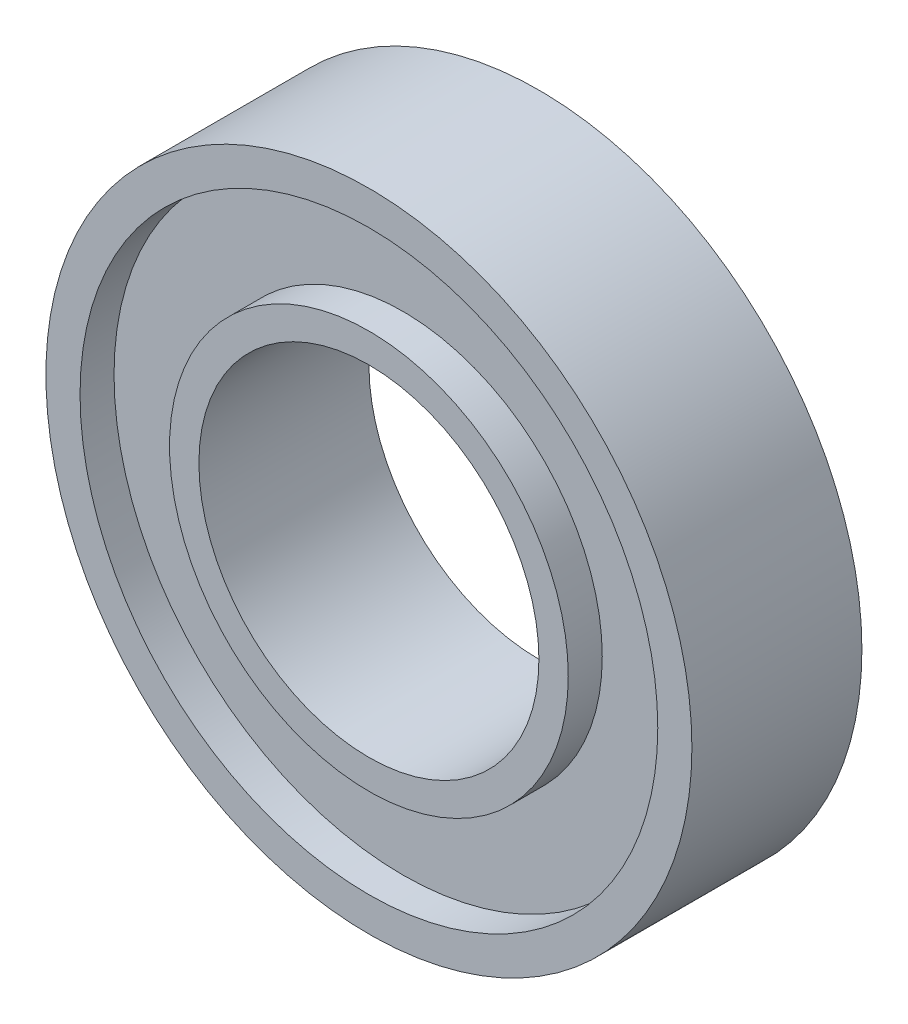
ISO-10303-21;
HEADER;
FILE_DESCRIPTION(('STEP AP214'),'2;1');
FILE_NAME('part.step','',(''),(''),'','','');
FILE_SCHEMA(('AUTOMOTIVE_DESIGN { 1 0 10303 214 1 1 1 1 }'));
ENDSEC;
DATA;
#1=APPLICATION_CONTEXT('core data for automotive mechanical design processes');
#2=APPLICATION_PROTOCOL_DEFINITION('international standard','automotive_design',2000,#1);
#3=PRODUCT_CONTEXT('',#1,'mechanical');
#4=PRODUCT('Part','Part','',(#3));
#5=PRODUCT_RELATED_PRODUCT_CATEGORY('part','',(#4));
#6=PRODUCT_DEFINITION_FORMATION('','',#4);
#7=PRODUCT_DEFINITION_CONTEXT('part definition',#1,'design');
#8=PRODUCT_DEFINITION('design','',#6,#7);
#9=PRODUCT_DEFINITION_SHAPE('','',#8);
#10=(LENGTH_UNIT() NAMED_UNIT(*) SI_UNIT(.MILLI.,.METRE.));
#11=(NAMED_UNIT(*) PLANE_ANGLE_UNIT() SI_UNIT($,.RADIAN.));
#12=(NAMED_UNIT(*) SI_UNIT($,.STERADIAN.) SOLID_ANGLE_UNIT());
#13=UNCERTAINTY_MEASURE_WITH_UNIT(LENGTH_MEASURE(1.E-05),#10,'distance_accuracy_value','');
#14=(GEOMETRIC_REPRESENTATION_CONTEXT(3) GLOBAL_UNCERTAINTY_ASSIGNED_CONTEXT((#13)) GLOBAL_UNIT_ASSIGNED_CONTEXT((#10,
#11,#12)) REPRESENTATION_CONTEXT('',''));
#15=CARTESIAN_POINT('',(0.,0.,0.));
#16=DIRECTION('',(0.,0.,1.));
#17=DIRECTION('',(1.,0.,0.));
#18=AXIS2_PLACEMENT_3D('',#15,#16,#17);
#19=CARTESIAN_POINT('',(0.,0.,0.));
#20=DIRECTION('',(0.,0.,1.));
#21=DIRECTION('',(1.,0.,0.));
#22=AXIS2_PLACEMENT_3D('',#19,#20,#21);
#23=PLANE('',#22);
#24=CARTESIAN_POINT('',(0.,0.,0.));
#25=DIRECTION('',(0.,0.,1.));
#26=DIRECTION('',(1.,0.,0.));
#27=AXIS2_PLACEMENT_3D('',#24,#25,#26);
#28=CIRCLE('',#27,5.);
#29=CARTESIAN_POINT('',(5.,0.,0.));
#30=VERTEX_POINT('',#29);
#31=EDGE_CURVE('E52',#30,#30,#28,.T.);
#32=ORIENTED_EDGE('',*,*,#31,.T.);
#33=EDGE_LOOP('',(#32));
#34=FACE_BOUND('',#33,.T.);
#35=CARTESIAN_POINT('',(0.,0.,0.));
#36=DIRECTION('',(0.,0.,1.));
#37=DIRECTION('',(1.,0.,0.));
#38=AXIS2_PLACEMENT_3D('',#35,#36,#37);
#39=CIRCLE('',#38,5.86336398365433);
#40=CARTESIAN_POINT('',(5.86336398365433,0.,0.));
#41=VERTEX_POINT('',#40);
#42=EDGE_CURVE('E84',#41,#41,#39,.T.);
#43=ORIENTED_EDGE('',*,*,#42,.F.);
#44=EDGE_LOOP('',(#43));
#45=FACE_BOUND('',#44,.T.);
#46=ADVANCED_FACE('F36',(#34,#45),#23,.F.);
#47=CARTESIAN_POINT('',(0.,0.,5.));
#48=DIRECTION('',(0.,0.,1.));
#49=DIRECTION('',(1.,0.,0.));
#50=AXIS2_PLACEMENT_3D('',#47,#48,#49);
#51=PLANE('',#50);
#52=CARTESIAN_POINT('',(0.,0.,5.));
#53=DIRECTION('',(0.,0.,1.));
#54=DIRECTION('',(1.,0.,0.));
#55=AXIS2_PLACEMENT_3D('',#52,#53,#54);
#56=CIRCLE('',#55,5.);
#57=CARTESIAN_POINT('',(5.,0.,5.));
#58=VERTEX_POINT('',#57);
#59=EDGE_CURVE('E50',#58,#58,#56,.T.);
#60=ORIENTED_EDGE('',*,*,#59,.F.);
#61=EDGE_LOOP('',(#60));
#62=FACE_BOUND('',#61,.T.);
#63=CARTESIAN_POINT('',(0.,0.,5.));
#64=DIRECTION('',(0.,0.,1.));
#65=DIRECTION('',(1.,0.,0.));
#66=AXIS2_PLACEMENT_3D('',#63,#64,#65);
#67=CIRCLE('',#66,5.86336398365433);
#68=CARTESIAN_POINT('',(5.86336398365433,0.,5.));
#69=VERTEX_POINT('',#68);
#70=EDGE_CURVE('E68',#69,#69,#67,.T.);
#71=ORIENTED_EDGE('',*,*,#70,.T.);
#72=EDGE_LOOP('',(#71));
#73=FACE_BOUND('',#72,.T.);
#74=ADVANCED_FACE('F101',(#62,#73),#51,.T.);
#75=CARTESIAN_POINT('',(0.,0.,5.));
#76=DIRECTION('',(0.,0.,1.));
#77=DIRECTION('',(1.,0.,0.));
#78=AXIS2_PLACEMENT_3D('',#75,#76,#77);
#79=CIRCLE('',#78,8.49623079290132);
#80=CARTESIAN_POINT('',(8.49623079290132,0.,5.));
#81=VERTEX_POINT('',#80);
#82=EDGE_CURVE('E60',#81,#81,#79,.T.);
#83=ORIENTED_EDGE('',*,*,#82,.F.);
#84=EDGE_LOOP('',(#83));
#85=FACE_BOUND('',#84,.T.);
#86=CARTESIAN_POINT('',(0.,0.,5.));
#87=DIRECTION('',(0.,0.,1.));
#88=DIRECTION('',(1.,0.,0.));
#89=AXIS2_PLACEMENT_3D('',#86,#87,#88);
#90=CIRCLE('',#89,9.5);
#91=CARTESIAN_POINT('',(9.5,0.,5.));
#92=VERTEX_POINT('',#91);
#93=EDGE_CURVE('E10',#92,#92,#90,.T.);
#94=ORIENTED_EDGE('',*,*,#93,.T.);
#95=EDGE_LOOP('',(#94));
#96=FACE_BOUND('',#95,.T.);
#97=ADVANCED_FACE('F107',(#85,#96),#51,.T.);
#98=CARTESIAN_POINT('',(0.,0.,0.));
#99=DIRECTION('',(0.,0.,1.));
#100=DIRECTION('',(1.,0.,0.));
#101=AXIS2_PLACEMENT_3D('',#98,#99,#100);
#102=CIRCLE('',#101,8.49623079290132);
#103=CARTESIAN_POINT('',(8.49623079290132,0.,0.));
#104=VERTEX_POINT('',#103);
#105=EDGE_CURVE('E76',#104,#104,#102,.T.);
#106=ORIENTED_EDGE('',*,*,#105,.T.);
#107=EDGE_LOOP('',(#106));
#108=FACE_BOUND('',#107,.T.);
#109=CARTESIAN_POINT('',(0.,0.,0.));
#110=DIRECTION('',(0.,0.,1.));
#111=DIRECTION('',(1.,0.,0.));
#112=AXIS2_PLACEMENT_3D('',#109,#110,#111);
#113=CIRCLE('',#112,9.5);
#114=CARTESIAN_POINT('',(9.5,0.,0.));
#115=VERTEX_POINT('',#114);
#116=EDGE_CURVE('E40',#115,#115,#113,.T.);
#117=ORIENTED_EDGE('',*,*,#116,.F.);
#118=EDGE_LOOP('',(#117));
#119=FACE_BOUND('',#118,.T.);
#120=ADVANCED_FACE('F103',(#108,#119),#23,.F.);
#121=CARTESIAN_POINT('',(0.,0.,5.));
#122=DIRECTION('',(0.,0.,-1.));
#123=DIRECTION('',(-1.,0.,0.));
#124=AXIS2_PLACEMENT_3D('',#121,#122,#123);
#125=CYLINDRICAL_SURFACE('',#124,9.5);
#126=ORIENTED_EDGE('',*,*,#93,.F.);
#127=EDGE_LOOP('',(#126));
#128=FACE_BOUND('',#127,.T.);
#129=ORIENTED_EDGE('',*,*,#116,.T.);
#130=EDGE_LOOP('',(#129));
#131=FACE_BOUND('',#130,.T.);
#132=ADVANCED_FACE('F38',(#128,#131),#125,.T.);
#133=CARTESIAN_POINT('',(0.,0.,5.));
#134=DIRECTION('',(0.,0.,-1.));
#135=DIRECTION('',(-1.,0.,0.));
#136=AXIS2_PLACEMENT_3D('',#133,#134,#135);
#137=CYLINDRICAL_SURFACE('',#136,5.);
#138=ORIENTED_EDGE('',*,*,#59,.T.);
#139=EDGE_LOOP('',(#138));
#140=FACE_BOUND('',#139,.T.);
#141=ORIENTED_EDGE('',*,*,#31,.F.);
#142=EDGE_LOOP('',(#141));
#143=FACE_BOUND('',#142,.T.);
#144=ADVANCED_FACE('F116',(#140,#143),#137,.F.);
#145=CARTESIAN_POINT('',(0.,0.,4.));
#146=DIRECTION('',(0.,0.,1.));
#147=DIRECTION('',(1.,0.,0.));
#148=AXIS2_PLACEMENT_3D('',#145,#146,#147);
#149=CYLINDRICAL_SURFACE('',#148,8.49623079290132);
#150=CARTESIAN_POINT('',(0.,0.,4.));
#151=DIRECTION('',(0.,0.,1.));
#152=DIRECTION('',(1.,0.,0.));
#153=AXIS2_PLACEMENT_3D('',#150,#151,#152);
#154=CIRCLE('',#153,8.49623079290132);
#155=CARTESIAN_POINT('',(8.49623079290132,0.,4.));
#156=VERTEX_POINT('',#155);
#157=EDGE_CURVE('E56',#156,#156,#154,.T.);
#158=ORIENTED_EDGE('',*,*,#157,.F.);
#159=EDGE_LOOP('',(#158));
#160=FACE_BOUND('',#159,.T.);
#161=ORIENTED_EDGE('',*,*,#82,.T.);
#162=EDGE_LOOP('',(#161));
#163=FACE_BOUND('',#162,.T.);
#164=ADVANCED_FACE('F140',(#160,#163),#149,.F.);
#165=CARTESIAN_POINT('',(0.,0.,4.));
#166=DIRECTION('',(0.,0.,1.));
#167=DIRECTION('',(1.,0.,0.));
#168=AXIS2_PLACEMENT_3D('',#165,#166,#167);
#169=PLANE('',#168);
#170=CARTESIAN_POINT('',(0.,0.,4.));
#171=DIRECTION('',(0.,0.,1.));
#172=DIRECTION('',(1.,0.,0.));
#173=AXIS2_PLACEMENT_3D('',#170,#171,#172);
#174=CIRCLE('',#173,5.86336398365433);
#175=CARTESIAN_POINT('',(5.86336398365433,0.,4.));
#176=VERTEX_POINT('',#175);
#177=EDGE_CURVE('E64',#176,#176,#174,.T.);
#178=ORIENTED_EDGE('',*,*,#177,.F.);
#179=EDGE_LOOP('',(#178));
#180=FACE_BOUND('',#179,.T.);
#181=ORIENTED_EDGE('',*,*,#157,.T.);
#182=EDGE_LOOP('',(#181));
#183=FACE_BOUND('',#182,.T.);
#184=ADVANCED_FACE('F136',(#180,#183),#169,.T.);
#185=CARTESIAN_POINT('',(0.,0.,4.));
#186=DIRECTION('',(0.,0.,1.));
#187=DIRECTION('',(1.,0.,0.));
#188=AXIS2_PLACEMENT_3D('',#185,#186,#187);
#189=CYLINDRICAL_SURFACE('',#188,5.86336398365433);
#190=ORIENTED_EDGE('',*,*,#177,.T.);
#191=EDGE_LOOP('',(#190));
#192=FACE_BOUND('',#191,.T.);
#193=ORIENTED_EDGE('',*,*,#70,.F.);
#194=EDGE_LOOP('',(#193));
#195=FACE_BOUND('',#194,.T.);
#196=ADVANCED_FACE('F130',(#192,#195),#189,.T.);
#197=CARTESIAN_POINT('',(0.,0.,1.));
#198=DIRECTION('',(0.,0.,-1.));
#199=DIRECTION('',(1.,0.,0.));
#200=AXIS2_PLACEMENT_3D('',#197,#198,#199);
#201=PLANE('',#200);
#202=CARTESIAN_POINT('',(0.,0.,1.));
#203=DIRECTION('',(0.,0.,1.));
#204=DIRECTION('',(1.,0.,0.));
#205=AXIS2_PLACEMENT_3D('',#202,#203,#204);
#206=CIRCLE('',#205,8.49623079290132);
#207=CARTESIAN_POINT('',(8.49623079290132,0.,1.));
#208=VERTEX_POINT('',#207);
#209=EDGE_CURVE('E72',#208,#208,#206,.T.);
#210=ORIENTED_EDGE('',*,*,#209,.F.);
#211=EDGE_LOOP('',(#210));
#212=FACE_BOUND('',#211,.T.);
#213=CARTESIAN_POINT('',(0.,0.,1.));
#214=DIRECTION('',(0.,0.,1.));
#215=DIRECTION('',(1.,0.,0.));
#216=AXIS2_PLACEMENT_3D('',#213,#214,#215);
#217=CIRCLE('',#216,5.86336398365433);
#218=CARTESIAN_POINT('',(5.86336398365433,0.,1.));
#219=VERTEX_POINT('',#218);
#220=EDGE_CURVE('E80',#219,#219,#217,.T.);
#221=ORIENTED_EDGE('',*,*,#220,.T.);
#222=EDGE_LOOP('',(#221));
#223=FACE_BOUND('',#222,.T.);
#224=ADVANCED_FACE('F91',(#212,#223),#201,.T.);
#225=CARTESIAN_POINT('',(0.,0.,1.));
#226=DIRECTION('',(0.,0.,-1.));
#227=DIRECTION('',(-1.,0.,0.));
#228=AXIS2_PLACEMENT_3D('',#225,#226,#227);
#229=CYLINDRICAL_SURFACE('',#228,8.49623079290132);
#230=ORIENTED_EDGE('',*,*,#209,.T.);
#231=EDGE_LOOP('',(#230));
#232=FACE_BOUND('',#231,.T.);
#233=ORIENTED_EDGE('',*,*,#105,.F.);
#234=EDGE_LOOP('',(#233));
#235=FACE_BOUND('',#234,.T.);
#236=ADVANCED_FACE('F96',(#232,#235),#229,.F.);
#237=CARTESIAN_POINT('',(0.,0.,1.));
#238=DIRECTION('',(0.,0.,-1.));
#239=DIRECTION('',(-1.,0.,0.));
#240=AXIS2_PLACEMENT_3D('',#237,#238,#239);
#241=CYLINDRICAL_SURFACE('',#240,5.86336398365433);
#242=ORIENTED_EDGE('',*,*,#220,.F.);
#243=EDGE_LOOP('',(#242));
#244=FACE_BOUND('',#243,.T.);
#245=ORIENTED_EDGE('',*,*,#42,.T.);
#246=EDGE_LOOP('',(#245));
#247=FACE_BOUND('',#246,.T.);
#248=ADVANCED_FACE('F93',(#244,#247),#241,.T.);
#249=CLOSED_SHELL('',(#46,#74,#97,#120,#132,#144,#164,#184,#196,#224,#236,#248));
#250=MANIFOLD_SOLID_BREP('B2',#249);
#251=ADVANCED_BREP_SHAPE_REPRESENTATION('',(#18,#250),#14);
#252=SHAPE_DEFINITION_REPRESENTATION(#9,#251);
ENDSEC;
END-ISO-10303-21;
